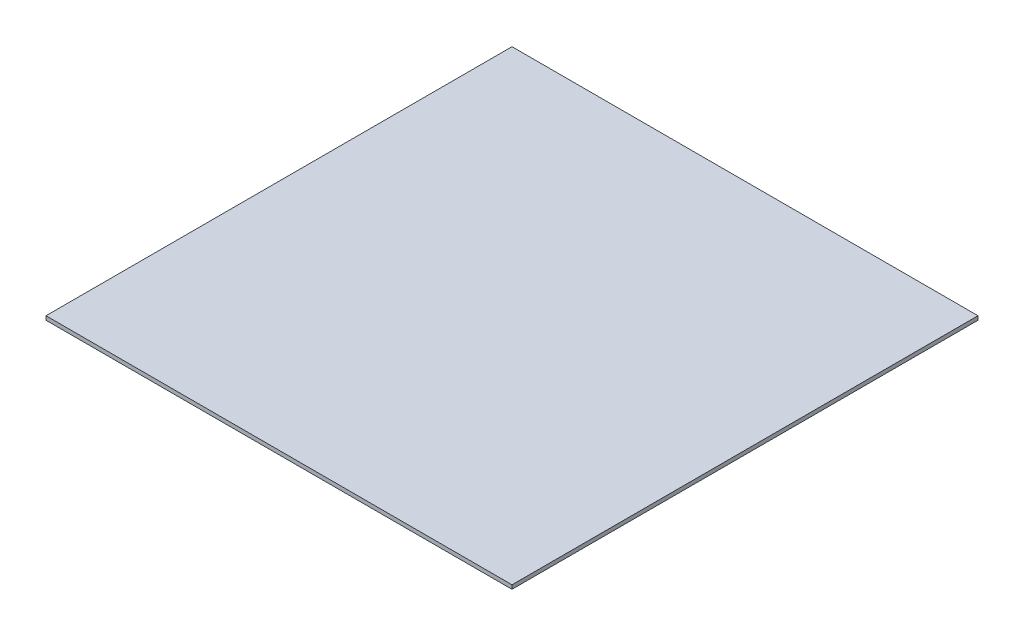
ISO-10303-21;
HEADER;
FILE_DESCRIPTION(('STEP AP214'),'2;1');
FILE_NAME('part.step','',(''),(''),'','','');
FILE_SCHEMA(('AUTOMOTIVE_DESIGN { 1 0 10303 214 1 1 1 1 }'));
ENDSEC;
DATA;
#1=APPLICATION_CONTEXT('core data for automotive mechanical design processes');
#2=APPLICATION_PROTOCOL_DEFINITION('international standard','automotive_design',2000,#1);
#3=PRODUCT_CONTEXT('',#1,'mechanical');
#4=PRODUCT('Part','Part','',(#3));
#5=PRODUCT_RELATED_PRODUCT_CATEGORY('part','',(#4));
#6=PRODUCT_DEFINITION_FORMATION('','',#4);
#7=PRODUCT_DEFINITION_CONTEXT('part definition',#1,'design');
#8=PRODUCT_DEFINITION('design','',#6,#7);
#9=PRODUCT_DEFINITION_SHAPE('','',#8);
#10=(LENGTH_UNIT() NAMED_UNIT(*) SI_UNIT(.MILLI.,.METRE.));
#11=(NAMED_UNIT(*) PLANE_ANGLE_UNIT() SI_UNIT($,.RADIAN.));
#12=(NAMED_UNIT(*) SI_UNIT($,.STERADIAN.) SOLID_ANGLE_UNIT());
#13=UNCERTAINTY_MEASURE_WITH_UNIT(LENGTH_MEASURE(1.E-05),#10,'distance_accuracy_value','');
#14=(GEOMETRIC_REPRESENTATION_CONTEXT(3) GLOBAL_UNCERTAINTY_ASSIGNED_CONTEXT((#13)) GLOBAL_UNIT_ASSIGNED_CONTEXT((#10,
#11,#12)) REPRESENTATION_CONTEXT('',''));
#15=CARTESIAN_POINT('',(0.,0.,0.));
#16=DIRECTION('',(0.,0.,1.));
#17=DIRECTION('',(1.,0.,0.));
#18=AXIS2_PLACEMENT_3D('',#15,#16,#17);
#19=CARTESIAN_POINT('',(94.8,0.8,94.8));
#20=DIRECTION('',(-1.,0.,0.));
#21=DIRECTION('',(0.,0.,1.));
#22=AXIS2_PLACEMENT_3D('',#19,#20,#21);
#23=PLANE('',#22);
#24=DIRECTION('',(0.,0.,-1.));
#25=VECTOR('',#24,1.);
#26=CARTESIAN_POINT('',(94.8,-0.8,94.8));
#27=LINE('',#26,#25);
#28=CARTESIAN_POINT('',(94.8,-0.8,94.8));
#29=VERTEX_POINT('',#28);
#30=CARTESIAN_POINT('',(94.8,-0.8,-94.8));
#31=VERTEX_POINT('',#30);
#32=EDGE_CURVE('E109',#29,#31,#27,.T.);
#33=ORIENTED_EDGE('',*,*,#32,.T.);
#34=DIRECTION('',(0.,-1.,0.));
#35=VECTOR('',#34,1.);
#36=CARTESIAN_POINT('',(94.8,0.8,-94.8));
#37=LINE('',#36,#35);
#38=CARTESIAN_POINT('',(94.8,0.8,-94.8));
#39=VERTEX_POINT('',#38);
#40=EDGE_CURVE('E11',#39,#31,#37,.T.);
#41=ORIENTED_EDGE('',*,*,#40,.F.);
#42=DIRECTION('',(0.,0.,-1.));
#43=VECTOR('',#42,1.);
#44=CARTESIAN_POINT('',(94.8,0.8,94.8));
#45=LINE('',#44,#43);
#46=CARTESIAN_POINT('',(94.8,0.8,94.8));
#47=VERTEX_POINT('',#46);
#48=EDGE_CURVE('E93',#47,#39,#45,.T.);
#49=ORIENTED_EDGE('',*,*,#48,.F.);
#50=DIRECTION('',(0.,-1.,0.));
#51=VECTOR('',#50,1.);
#52=CARTESIAN_POINT('',(94.8,0.8,94.8));
#53=LINE('',#52,#51);
#54=EDGE_CURVE('E105',#47,#29,#53,.T.);
#55=ORIENTED_EDGE('',*,*,#54,.T.);
#56=EDGE_LOOP('',(#33,#41,#49,#55));
#57=FACE_BOUND('',#56,.T.);
#58=ADVANCED_FACE('F41',(#57),#23,.F.);
#59=CARTESIAN_POINT('',(-94.8,0.8,-94.8));
#60=DIRECTION('',(0.,0.,1.));
#61=DIRECTION('',(1.,0.,0.));
#62=AXIS2_PLACEMENT_3D('',#59,#60,#61);
#63=PLANE('',#62);
#64=DIRECTION('',(-1.,0.,0.));
#65=VECTOR('',#64,1.);
#66=CARTESIAN_POINT('',(-94.8,-0.8,-94.8));
#67=LINE('',#66,#65);
#68=CARTESIAN_POINT('',(-94.8,-0.8,-94.8));
#69=VERTEX_POINT('',#68);
#70=EDGE_CURVE('E98',#31,#69,#67,.T.);
#71=ORIENTED_EDGE('',*,*,#70,.T.);
#72=DIRECTION('',(0.,-1.,0.));
#73=VECTOR('',#72,1.);
#74=CARTESIAN_POINT('',(-94.8,0.8,-94.8));
#75=LINE('',#74,#73);
#76=CARTESIAN_POINT('',(-94.8,0.8,-94.8));
#77=VERTEX_POINT('',#76);
#78=EDGE_CURVE('E50',#77,#69,#75,.T.);
#79=ORIENTED_EDGE('',*,*,#78,.F.);
#80=DIRECTION('',(-1.,0.,0.));
#81=VECTOR('',#80,1.);
#82=CARTESIAN_POINT('',(-94.8,0.8,-94.8));
#83=LINE('',#82,#81);
#84=EDGE_CURVE('E88',#39,#77,#83,.T.);
#85=ORIENTED_EDGE('',*,*,#84,.F.);
#86=ORIENTED_EDGE('',*,*,#40,.T.);
#87=EDGE_LOOP('',(#71,#79,#85,#86));
#88=FACE_BOUND('',#87,.T.);
#89=ADVANCED_FACE('F97',(#88),#63,.F.);
#90=CARTESIAN_POINT('',(-94.8,0.8,94.8));
#91=DIRECTION('',(1.,0.,0.));
#92=DIRECTION('',(0.,0.,-1.));
#93=AXIS2_PLACEMENT_3D('',#90,#91,#92);
#94=PLANE('',#93);
#95=DIRECTION('',(0.,0.,1.));
#96=VECTOR('',#95,1.);
#97=CARTESIAN_POINT('',(-94.8,-0.8,94.8));
#98=LINE('',#97,#96);
#99=CARTESIAN_POINT('',(-94.8,-0.8,94.8));
#100=VERTEX_POINT('',#99);
#101=EDGE_CURVE('E75',#69,#100,#98,.T.);
#102=ORIENTED_EDGE('',*,*,#101,.T.);
#103=DIRECTION('',(0.,-1.,0.));
#104=VECTOR('',#103,1.);
#105=CARTESIAN_POINT('',(-94.8,0.8,94.8));
#106=LINE('',#105,#104);
#107=CARTESIAN_POINT('',(-94.8,0.8,94.8));
#108=VERTEX_POINT('',#107);
#109=EDGE_CURVE('E100',#108,#100,#106,.T.);
#110=ORIENTED_EDGE('',*,*,#109,.F.);
#111=DIRECTION('',(0.,0.,1.));
#112=VECTOR('',#111,1.);
#113=CARTESIAN_POINT('',(-94.8,0.8,94.8));
#114=LINE('',#113,#112);
#115=EDGE_CURVE('E91',#77,#108,#114,.T.);
#116=ORIENTED_EDGE('',*,*,#115,.F.);
#117=ORIENTED_EDGE('',*,*,#78,.T.);
#118=EDGE_LOOP('',(#102,#110,#116,#117));
#119=FACE_BOUND('',#118,.T.);
#120=ADVANCED_FACE('F101',(#119),#94,.F.);
#121=CARTESIAN_POINT('',(-94.8,0.8,94.8));
#122=DIRECTION('',(0.,0.,-1.));
#123=DIRECTION('',(-1.,0.,0.));
#124=AXIS2_PLACEMENT_3D('',#121,#122,#123);
#125=PLANE('',#124);
#126=DIRECTION('',(1.,0.,0.));
#127=VECTOR('',#126,1.);
#128=CARTESIAN_POINT('',(-94.8,-0.8,94.8));
#129=LINE('',#128,#127);
#130=EDGE_CURVE('E81',#100,#29,#129,.T.);
#131=ORIENTED_EDGE('',*,*,#130,.T.);
#132=ORIENTED_EDGE('',*,*,#54,.F.);
#133=DIRECTION('',(1.,0.,0.));
#134=VECTOR('',#133,1.);
#135=CARTESIAN_POINT('',(-94.8,0.8,94.8));
#136=LINE('',#135,#134);
#137=EDGE_CURVE('E58',#108,#47,#136,.T.);
#138=ORIENTED_EDGE('',*,*,#137,.F.);
#139=ORIENTED_EDGE('',*,*,#109,.T.);
#140=EDGE_LOOP('',(#131,#132,#138,#139));
#141=FACE_BOUND('',#140,.T.);
#142=ADVANCED_FACE('F122',(#141),#125,.F.);
#143=CARTESIAN_POINT('',(0.,0.8,0.));
#144=DIRECTION('',(0.,-1.,0.));
#145=DIRECTION('',(0.,0.,-1.));
#146=AXIS2_PLACEMENT_3D('',#143,#144,#145);
#147=PLANE('',#146);
#148=ORIENTED_EDGE('',*,*,#48,.T.);
#149=ORIENTED_EDGE('',*,*,#84,.T.);
#150=ORIENTED_EDGE('',*,*,#115,.T.);
#151=ORIENTED_EDGE('',*,*,#137,.T.);
#152=EDGE_LOOP('',(#148,#149,#150,#151));
#153=FACE_BOUND('',#152,.T.);
#154=ADVANCED_FACE('F89',(#153),#147,.F.);
#155=CARTESIAN_POINT('',(0.,-0.8,0.));
#156=DIRECTION('',(0.,-1.,0.));
#157=DIRECTION('',(0.,0.,-1.));
#158=AXIS2_PLACEMENT_3D('',#155,#156,#157);
#159=PLANE('',#158);
#160=ORIENTED_EDGE('',*,*,#32,.F.);
#161=ORIENTED_EDGE('',*,*,#130,.F.);
#162=ORIENTED_EDGE('',*,*,#101,.F.);
#163=ORIENTED_EDGE('',*,*,#70,.F.);
#164=EDGE_LOOP('',(#160,#161,#162,#163));
#165=FACE_BOUND('',#164,.T.);
#166=ADVANCED_FACE('F125',(#165),#159,.T.);
#167=CLOSED_SHELL('',(#58,#89,#120,#142,#154,#166));
#168=MANIFOLD_SOLID_BREP('B2',#167);
#169=ADVANCED_BREP_SHAPE_REPRESENTATION('',(#18,#168),#14);
#170=SHAPE_DEFINITION_REPRESENTATION(#9,#169);
ENDSEC;
END-ISO-10303-21;
